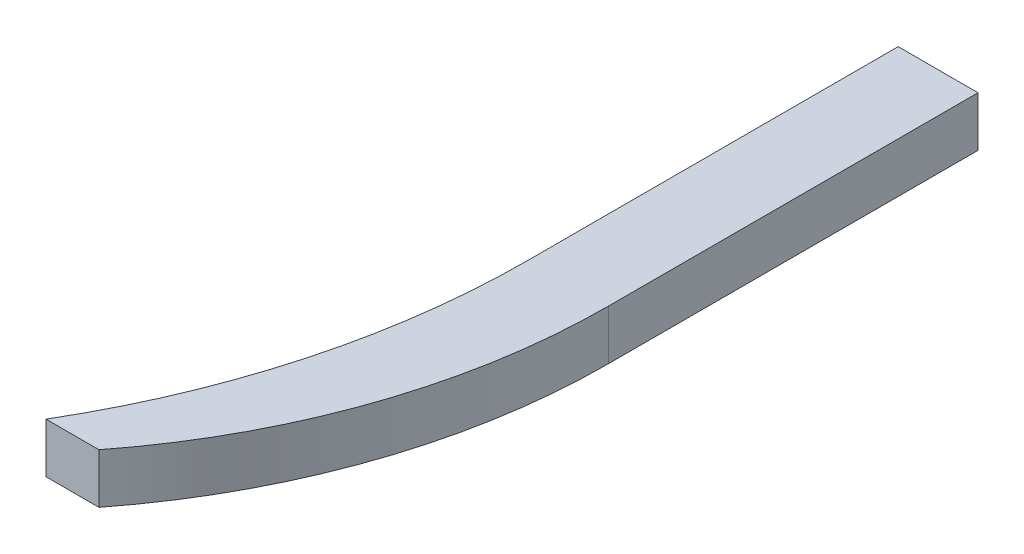
ISO-10303-21;
HEADER;
FILE_DESCRIPTION(('STEP AP214'),'2;1');
FILE_NAME('part.step','',(''),(''),'','','');
FILE_SCHEMA(('AUTOMOTIVE_DESIGN { 1 0 10303 214 1 1 1 1 }'));
ENDSEC;
DATA;
#1=APPLICATION_CONTEXT('core data for automotive mechanical design processes');
#2=APPLICATION_PROTOCOL_DEFINITION('international standard','automotive_design',2000,#1);
#3=PRODUCT_CONTEXT('',#1,'mechanical');
#4=PRODUCT('Part','Part','',(#3));
#5=PRODUCT_RELATED_PRODUCT_CATEGORY('part','',(#4));
#6=PRODUCT_DEFINITION_FORMATION('','',#4);
#7=PRODUCT_DEFINITION_CONTEXT('part definition',#1,'design');
#8=PRODUCT_DEFINITION('design','',#6,#7);
#9=PRODUCT_DEFINITION_SHAPE('','',#8);
#10=(LENGTH_UNIT() NAMED_UNIT(*) SI_UNIT(.MILLI.,.METRE.));
#11=(NAMED_UNIT(*) PLANE_ANGLE_UNIT() SI_UNIT($,.RADIAN.));
#12=(NAMED_UNIT(*) SI_UNIT($,.STERADIAN.) SOLID_ANGLE_UNIT());
#13=UNCERTAINTY_MEASURE_WITH_UNIT(LENGTH_MEASURE(1.E-05),#10,'distance_accuracy_value','');
#14=(GEOMETRIC_REPRESENTATION_CONTEXT(3) GLOBAL_UNCERTAINTY_ASSIGNED_CONTEXT((#13)) GLOBAL_UNIT_ASSIGNED_CONTEXT((#10,
#11,#12)) REPRESENTATION_CONTEXT('',''));
#15=CARTESIAN_POINT('',(0.,0.,0.));
#16=DIRECTION('',(0.,0.,1.));
#17=DIRECTION('',(1.,0.,0.));
#18=AXIS2_PLACEMENT_3D('',#15,#16,#17);
#19=CARTESIAN_POINT('',(0.,5.,8.));
#20=DIRECTION('',(1.,0.,0.));
#21=DIRECTION('',(0.,0.,-1.));
#22=AXIS2_PLACEMENT_3D('',#19,#20,#21);
#23=PLANE('',#22);
#24=DIRECTION('',(0.,0.,1.));
#25=VECTOR('',#24,1.);
#26=CARTESIAN_POINT('',(0.,0.,8.));
#27=LINE('',#26,#25);
#28=CARTESIAN_POINT('',(0.,0.,0.));
#29=VERTEX_POINT('',#28);
#30=CARTESIAN_POINT('',(0.,0.,37.));
#31=VERTEX_POINT('',#30);
#32=EDGE_CURVE('E76',#29,#31,#27,.T.);
#33=ORIENTED_EDGE('',*,*,#32,.T.);
#34=DIRECTION('',(0.,-1.,0.));
#35=VECTOR('',#34,1.);
#36=CARTESIAN_POINT('',(0.,5.,37.));
#37=LINE('',#36,#35);
#38=CARTESIAN_POINT('',(0.,5.,37.));
#39=VERTEX_POINT('',#38);
#40=EDGE_CURVE('E40',#39,#31,#37,.T.);
#41=ORIENTED_EDGE('',*,*,#40,.F.);
#42=DIRECTION('',(0.,0.,1.));
#43=VECTOR('',#42,1.);
#44=CARTESIAN_POINT('',(0.,5.,8.));
#45=LINE('',#44,#43);
#46=CARTESIAN_POINT('',(0.,5.,0.));
#47=VERTEX_POINT('',#46);
#48=EDGE_CURVE('E81',#47,#39,#45,.T.);
#49=ORIENTED_EDGE('',*,*,#48,.F.);
#50=DIRECTION('',(0.,-1.,0.));
#51=VECTOR('',#50,1.);
#52=CARTESIAN_POINT('',(0.,5.,0.));
#53=LINE('',#52,#51);
#54=EDGE_CURVE('E116',#47,#29,#53,.T.);
#55=ORIENTED_EDGE('',*,*,#54,.T.);
#56=EDGE_LOOP('',(#33,#41,#49,#55));
#57=FACE_BOUND('',#56,.T.);
#58=ADVANCED_FACE('F33',(#57),#23,.F.);
#59=CARTESIAN_POINT('',(-74.840909090909,5.,37.));
#60=DIRECTION('',(0.,-1.,0.));
#61=DIRECTION('',(0.,0.,-1.));
#62=AXIS2_PLACEMENT_3D('',#59,#60,#61);
#63=CYLINDRICAL_SURFACE('',#62,74.840909090909);
#64=CARTESIAN_POINT('',(-74.840909090909,0.,37.));
#65=DIRECTION('',(0.,-1.,0.));
#66=DIRECTION('',(0.,0.,-1.));
#67=AXIS2_PLACEMENT_3D('',#64,#65,#66);
#68=CIRCLE('',#67,74.840909090909);
#69=CARTESIAN_POINT('',(-10.3648540506562,0.,75.0000000000001));
#70=VERTEX_POINT('',#69);
#71=EDGE_CURVE('E118',#31,#70,#68,.T.);
#72=ORIENTED_EDGE('',*,*,#71,.T.);
#73=DIRECTION('',(0.,1.,0.));
#74=VECTOR('',#73,1.);
#75=CARTESIAN_POINT('',(-10.3648540506562,-5.,75.0000000000001));
#76=LINE('',#75,#74);
#77=CARTESIAN_POINT('',(-10.3648540506562,5.,75.0000000000001));
#78=VERTEX_POINT('',#77);
#79=EDGE_CURVE('E46',#70,#78,#76,.T.);
#80=ORIENTED_EDGE('',*,*,#79,.T.);
#81=CARTESIAN_POINT('',(-74.840909090909,5.,37.));
#82=DIRECTION('',(0.,-1.,0.));
#83=DIRECTION('',(0.,0.,-1.));
#84=AXIS2_PLACEMENT_3D('',#81,#82,#83);
#85=CIRCLE('',#84,74.840909090909);
#86=EDGE_CURVE('E103',#39,#78,#85,.T.);
#87=ORIENTED_EDGE('',*,*,#86,.F.);
#88=ORIENTED_EDGE('',*,*,#40,.T.);
#89=EDGE_LOOP('',(#72,#80,#87,#88));
#90=FACE_BOUND('',#89,.T.);
#91=ADVANCED_FACE('F134',(#90),#63,.F.);
#92=CARTESIAN_POINT('',(-53.8166666666666,5.,37.));
#93=DIRECTION('',(0.,-1.,0.));
#94=DIRECTION('',(0.,0.,-1.));
#95=AXIS2_PLACEMENT_3D('',#92,#93,#94);
#96=CYLINDRICAL_SURFACE('',#95,61.8166666666667);
#97=CARTESIAN_POINT('',(-53.8166666666666,5.,37.));
#98=DIRECTION('',(0.,1.,0.));
#99=DIRECTION('',(0.,0.,-1.));
#100=AXIS2_PLACEMENT_3D('',#97,#98,#99);
#101=CIRCLE('',#100,61.8166666666667);
#102=CARTESIAN_POINT('',(-5.05910030227787,5.,75.0000000000001));
#103=VERTEX_POINT('',#102);
#104=CARTESIAN_POINT('',(8.00000000000001,5.,37.));
#105=VERTEX_POINT('',#104);
#106=EDGE_CURVE('E100',#103,#105,#101,.T.);
#107=ORIENTED_EDGE('',*,*,#106,.F.);
#108=DIRECTION('',(0.,1.,0.));
#109=VECTOR('',#108,1.);
#110=CARTESIAN_POINT('',(-5.05910030227787,-5.,75.0000000000001));
#111=LINE('',#110,#109);
#112=CARTESIAN_POINT('',(-5.05910030227787,0.,75.0000000000001));
#113=VERTEX_POINT('',#112);
#114=EDGE_CURVE('E91',#113,#103,#111,.T.);
#115=ORIENTED_EDGE('',*,*,#114,.F.);
#116=CARTESIAN_POINT('',(-53.8166666666666,0.,37.));
#117=DIRECTION('',(0.,1.,0.));
#118=DIRECTION('',(0.,0.,-1.));
#119=AXIS2_PLACEMENT_3D('',#116,#117,#118);
#120=CIRCLE('',#119,61.8166666666667);
#121=CARTESIAN_POINT('',(8.00000000000001,0.,37.));
#122=VERTEX_POINT('',#121);
#123=EDGE_CURVE('E121',#113,#122,#120,.T.);
#124=ORIENTED_EDGE('',*,*,#123,.T.);
#125=DIRECTION('',(0.,-1.,0.));
#126=VECTOR('',#125,1.);
#127=CARTESIAN_POINT('',(8.00000000000001,5.,37.));
#128=LINE('',#127,#126);
#129=EDGE_CURVE('E107',#105,#122,#128,.T.);
#130=ORIENTED_EDGE('',*,*,#129,.F.);
#131=EDGE_LOOP('',(#107,#115,#124,#130));
#132=FACE_BOUND('',#131,.T.);
#133=ADVANCED_FACE('F105',(#132),#96,.T.);
#134=CARTESIAN_POINT('',(8.,5.,0.));
#135=DIRECTION('',(-1.,0.,0.));
#136=DIRECTION('',(0.,0.,1.));
#137=AXIS2_PLACEMENT_3D('',#134,#135,#136);
#138=PLANE('',#137);
#139=DIRECTION('',(0.,0.,-1.));
#140=VECTOR('',#139,1.);
#141=CARTESIAN_POINT('',(8.,0.,0.));
#142=LINE('',#141,#140);
#143=CARTESIAN_POINT('',(8.,0.,0.));
#144=VERTEX_POINT('',#143);
#145=EDGE_CURVE('E123',#122,#144,#142,.T.);
#146=ORIENTED_EDGE('',*,*,#145,.T.);
#147=DIRECTION('',(0.,-1.,0.));
#148=VECTOR('',#147,1.);
#149=CARTESIAN_POINT('',(8.,5.,0.));
#150=LINE('',#149,#148);
#151=CARTESIAN_POINT('',(8.,5.,0.));
#152=VERTEX_POINT('',#151);
#153=EDGE_CURVE('E129',#152,#144,#150,.T.);
#154=ORIENTED_EDGE('',*,*,#153,.F.);
#155=DIRECTION('',(0.,0.,-1.));
#156=VECTOR('',#155,1.);
#157=CARTESIAN_POINT('',(8.,5.,0.));
#158=LINE('',#157,#156);
#159=EDGE_CURVE('E109',#105,#152,#158,.T.);
#160=ORIENTED_EDGE('',*,*,#159,.F.);
#161=ORIENTED_EDGE('',*,*,#129,.T.);
#162=EDGE_LOOP('',(#146,#154,#160,#161));
#163=FACE_BOUND('',#162,.T.);
#164=ADVANCED_FACE('F139',(#163),#138,.F.);
#165=CARTESIAN_POINT('',(0.,5.,0.));
#166=DIRECTION('',(0.,0.,1.));
#167=DIRECTION('',(1.,0.,0.));
#168=AXIS2_PLACEMENT_3D('',#165,#166,#167);
#169=PLANE('',#168);
#170=DIRECTION('',(-1.,0.,0.));
#171=VECTOR('',#170,1.);
#172=CARTESIAN_POINT('',(0.,0.,0.));
#173=LINE('',#172,#171);
#174=EDGE_CURVE('E125',#144,#29,#173,.T.);
#175=ORIENTED_EDGE('',*,*,#174,.T.);
#176=ORIENTED_EDGE('',*,*,#54,.F.);
#177=DIRECTION('',(-1.,0.,0.));
#178=VECTOR('',#177,1.);
#179=CARTESIAN_POINT('',(0.,5.,0.));
#180=LINE('',#179,#178);
#181=EDGE_CURVE('E55',#152,#47,#180,.T.);
#182=ORIENTED_EDGE('',*,*,#181,.F.);
#183=ORIENTED_EDGE('',*,*,#153,.T.);
#184=EDGE_LOOP('',(#175,#176,#182,#183));
#185=FACE_BOUND('',#184,.T.);
#186=ADVANCED_FACE('F142',(#185),#169,.F.);
#187=CARTESIAN_POINT('',(-53.8166666666666,5.,37.));
#188=DIRECTION('',(0.,-1.,0.));
#189=DIRECTION('',(0.,0.,-1.));
#190=AXIS2_PLACEMENT_3D('',#187,#188,#189);
#191=PLANE('',#190);
#192=ORIENTED_EDGE('',*,*,#86,.T.);
#193=DIRECTION('',(-1.,0.,0.));
#194=VECTOR('',#193,1.);
#195=CARTESIAN_POINT('',(-10.3648540506562,5.,75.0000000000001));
#196=LINE('',#195,#194);
#197=EDGE_CURVE('E94',#103,#78,#196,.T.);
#198=ORIENTED_EDGE('',*,*,#197,.F.);
#199=ORIENTED_EDGE('',*,*,#106,.T.);
#200=ORIENTED_EDGE('',*,*,#159,.T.);
#201=ORIENTED_EDGE('',*,*,#181,.T.);
#202=ORIENTED_EDGE('',*,*,#48,.T.);
#203=EDGE_LOOP('',(#192,#198,#199,#200,#201,#202));
#204=FACE_BOUND('',#203,.T.);
#205=ADVANCED_FACE('F99',(#204),#191,.F.);
#206=CARTESIAN_POINT('',(-53.8166666666666,0.,37.));
#207=DIRECTION('',(0.,-1.,0.));
#208=DIRECTION('',(0.,0.,-1.));
#209=AXIS2_PLACEMENT_3D('',#206,#207,#208);
#210=PLANE('',#209);
#211=DIRECTION('',(1.,0.,0.));
#212=VECTOR('',#211,1.);
#213=CARTESIAN_POINT('',(-53.8166666666666,0.,75.0000000000001));
#214=LINE('',#213,#212);
#215=EDGE_CURVE('E11',#70,#113,#214,.T.);
#216=ORIENTED_EDGE('',*,*,#215,.F.);
#217=ORIENTED_EDGE('',*,*,#71,.F.);
#218=ORIENTED_EDGE('',*,*,#32,.F.);
#219=ORIENTED_EDGE('',*,*,#174,.F.);
#220=ORIENTED_EDGE('',*,*,#145,.F.);
#221=ORIENTED_EDGE('',*,*,#123,.F.);
#222=EDGE_LOOP('',(#216,#217,#218,#219,#220,#221));
#223=FACE_BOUND('',#222,.T.);
#224=ADVANCED_FACE('F136',(#223),#210,.T.);
#225=CARTESIAN_POINT('',(-10.3648540506562,-5.,75.0000000000001));
#226=DIRECTION('',(0.,0.,-1.));
#227=DIRECTION('',(-1.,0.,0.));
#228=AXIS2_PLACEMENT_3D('',#225,#226,#227);
#229=PLANE('',#228);
#230=ORIENTED_EDGE('',*,*,#215,.T.);
#231=ORIENTED_EDGE('',*,*,#114,.T.);
#232=ORIENTED_EDGE('',*,*,#197,.T.);
#233=ORIENTED_EDGE('',*,*,#79,.F.);
#234=EDGE_LOOP('',(#230,#231,#232,#233));
#235=FACE_BOUND('',#234,.T.);
#236=ADVANCED_FACE('F93',(#235),#229,.F.);
#237=CLOSED_SHELL('',(#58,#91,#133,#164,#186,#205,#224,#236));
#238=MANIFOLD_SOLID_BREP('B2',#237);
#239=ADVANCED_BREP_SHAPE_REPRESENTATION('',(#18,#238),#14);
#240=SHAPE_DEFINITION_REPRESENTATION(#9,#239);
ENDSEC;
END-ISO-10303-21;
